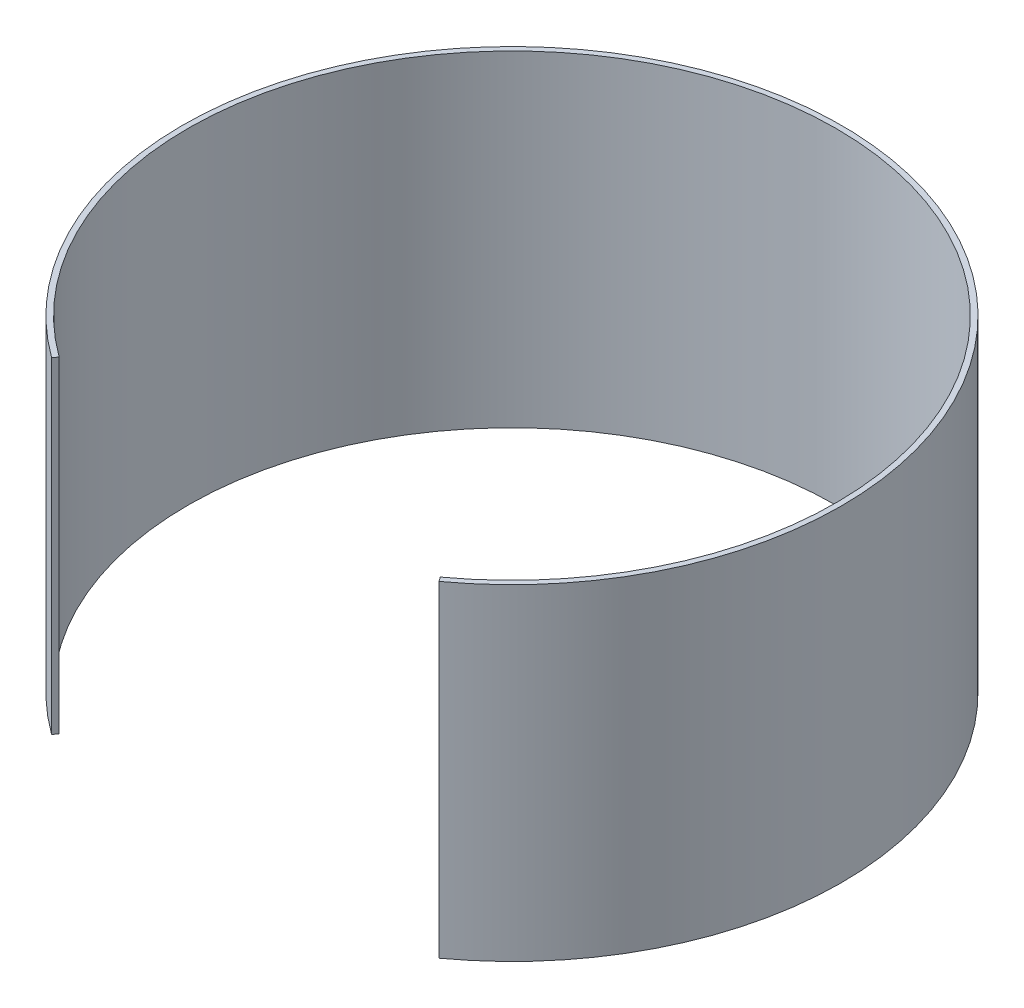
ISO-10303-21;
HEADER;
FILE_DESCRIPTION(('STEP AP214'),'2;1');
FILE_NAME('part.step','',(''),(''),'','','');
FILE_SCHEMA(('AUTOMOTIVE_DESIGN { 1 0 10303 214 1 1 1 1 }'));
ENDSEC;
DATA;
#1=APPLICATION_CONTEXT('core data for automotive mechanical design processes');
#2=APPLICATION_PROTOCOL_DEFINITION('international standard','automotive_design',2000,#1);
#3=PRODUCT_CONTEXT('',#1,'mechanical');
#4=PRODUCT('Part','Part','',(#3));
#5=PRODUCT_RELATED_PRODUCT_CATEGORY('part','',(#4));
#6=PRODUCT_DEFINITION_FORMATION('','',#4);
#7=PRODUCT_DEFINITION_CONTEXT('part definition',#1,'design');
#8=PRODUCT_DEFINITION('design','',#6,#7);
#9=PRODUCT_DEFINITION_SHAPE('','',#8);
#10=(LENGTH_UNIT() NAMED_UNIT(*) SI_UNIT(.MILLI.,.METRE.));
#11=(NAMED_UNIT(*) PLANE_ANGLE_UNIT() SI_UNIT($,.RADIAN.));
#12=(NAMED_UNIT(*) SI_UNIT($,.STERADIAN.) SOLID_ANGLE_UNIT());
#13=UNCERTAINTY_MEASURE_WITH_UNIT(LENGTH_MEASURE(1.E-05),#10,'distance_accuracy_value','');
#14=(GEOMETRIC_REPRESENTATION_CONTEXT(3) GLOBAL_UNCERTAINTY_ASSIGNED_CONTEXT((#13)) GLOBAL_UNIT_ASSIGNED_CONTEXT((#10,
#11,#12)) REPRESENTATION_CONTEXT('',''));
#15=CARTESIAN_POINT('',(0.,0.,0.));
#16=DIRECTION('',(0.,0.,1.));
#17=DIRECTION('',(1.,0.,0.));
#18=AXIS2_PLACEMENT_3D('',#15,#16,#17);
#19=CARTESIAN_POINT('',(0.,302.,0.));
#20=DIRECTION('',(0.,-1.,0.));
#21=DIRECTION('',(0.,0.,-1.));
#22=AXIS2_PLACEMENT_3D('',#19,#20,#21);
#23=CYLINDRICAL_SURFACE('',#22,305.);
#24=CARTESIAN_POINT('',(0.,0.,0.));
#25=DIRECTION('',(0.,1.,0.));
#26=DIRECTION('',(0.,0.,1.));
#27=AXIS2_PLACEMENT_3D('',#24,#25,#26);
#28=CIRCLE('',#27,305.);
#29=CARTESIAN_POINT('',(179.274501949204,0.,246.750183284359));
#30=VERTEX_POINT('',#29);
#31=CARTESIAN_POINT('',(-179.274501949204,0.,246.750183284359));
#32=VERTEX_POINT('',#31);
#33=EDGE_CURVE('E107',#30,#32,#28,.T.);
#34=ORIENTED_EDGE('',*,*,#33,.T.);
#35=DIRECTION('',(0.,-1.,0.));
#36=VECTOR('',#35,1.);
#37=CARTESIAN_POINT('',(-179.274501949204,302.,246.750183284359));
#38=LINE('',#37,#36);
#39=CARTESIAN_POINT('',(-179.274501949204,302.,246.750183284359));
#40=VERTEX_POINT('',#39);
#41=EDGE_CURVE('E11',#40,#32,#38,.T.);
#42=ORIENTED_EDGE('',*,*,#41,.F.);
#43=CARTESIAN_POINT('',(0.,302.,0.));
#44=DIRECTION('',(0.,1.,0.));
#45=DIRECTION('',(0.,0.,1.));
#46=AXIS2_PLACEMENT_3D('',#43,#44,#45);
#47=CIRCLE('',#46,305.);
#48=CARTESIAN_POINT('',(179.274501949204,302.,246.750183284359));
#49=VERTEX_POINT('',#48);
#50=EDGE_CURVE('E91',#49,#40,#47,.T.);
#51=ORIENTED_EDGE('',*,*,#50,.F.);
#52=DIRECTION('',(0.,-1.,0.));
#53=VECTOR('',#52,1.);
#54=CARTESIAN_POINT('',(179.274501949204,302.,246.750183284359));
#55=LINE('',#54,#53);
#56=EDGE_CURVE('E103',#49,#30,#55,.T.);
#57=ORIENTED_EDGE('',*,*,#56,.T.);
#58=EDGE_LOOP('',(#34,#42,#51,#57));
#59=FACE_BOUND('',#58,.T.);
#60=ADVANCED_FACE('F39',(#59),#23,.T.);
#61=CARTESIAN_POINT('',(-176.335575687742,302.,242.705098312484));
#62=DIRECTION('',(-0.809016994374947,0.,-0.587785252292474));
#63=DIRECTION('',(-0.587785252292474,0.,0.809016994374947));
#64=AXIS2_PLACEMENT_3D('',#61,#62,#63);
#65=PLANE('',#64);
#66=DIRECTION('',(0.587785252292474,0.,-0.809016994374947));
#67=VECTOR('',#66,1.);
#68=CARTESIAN_POINT('',(-176.335575687742,0.,242.705098312484));
#69=LINE('',#68,#67);
#70=CARTESIAN_POINT('',(-176.335575687742,0.,242.705098312484));
#71=VERTEX_POINT('',#70);
#72=EDGE_CURVE('E96',#32,#71,#69,.T.);
#73=ORIENTED_EDGE('',*,*,#72,.T.);
#74=DIRECTION('',(0.,-1.,0.));
#75=VECTOR('',#74,1.);
#76=CARTESIAN_POINT('',(-176.335575687742,302.,242.705098312484));
#77=LINE('',#76,#75);
#78=CARTESIAN_POINT('',(-176.335575687742,302.,242.705098312484));
#79=VERTEX_POINT('',#78);
#80=EDGE_CURVE('E48',#79,#71,#77,.T.);
#81=ORIENTED_EDGE('',*,*,#80,.F.);
#82=DIRECTION('',(0.587785252292474,0.,-0.809016994374947));
#83=VECTOR('',#82,1.);
#84=CARTESIAN_POINT('',(-176.335575687742,302.,242.705098312484));
#85=LINE('',#84,#83);
#86=EDGE_CURVE('E86',#40,#79,#85,.T.);
#87=ORIENTED_EDGE('',*,*,#86,.F.);
#88=ORIENTED_EDGE('',*,*,#41,.T.);
#89=EDGE_LOOP('',(#73,#81,#87,#88));
#90=FACE_BOUND('',#89,.T.);
#91=ADVANCED_FACE('F95',(#90),#65,.F.);
#92=CARTESIAN_POINT('',(0.,302.,0.));
#93=DIRECTION('',(0.,-1.,0.));
#94=DIRECTION('',(0.,0.,-1.));
#95=AXIS2_PLACEMENT_3D('',#92,#93,#94);
#96=CYLINDRICAL_SURFACE('',#95,300.);
#97=CARTESIAN_POINT('',(0.,0.,0.));
#98=DIRECTION('',(0.,-1.,0.));
#99=DIRECTION('',(0.,0.,1.));
#100=AXIS2_PLACEMENT_3D('',#97,#98,#99);
#101=CIRCLE('',#100,300.);
#102=CARTESIAN_POINT('',(176.335575687742,0.,242.705098312484));
#103=VERTEX_POINT('',#102);
#104=EDGE_CURVE('E73',#71,#103,#101,.T.);
#105=ORIENTED_EDGE('',*,*,#104,.T.);
#106=DIRECTION('',(0.,-1.,0.));
#107=VECTOR('',#106,1.);
#108=CARTESIAN_POINT('',(176.335575687742,302.,242.705098312484));
#109=LINE('',#108,#107);
#110=CARTESIAN_POINT('',(176.335575687742,302.,242.705098312484));
#111=VERTEX_POINT('',#110);
#112=EDGE_CURVE('E98',#111,#103,#109,.T.);
#113=ORIENTED_EDGE('',*,*,#112,.F.);
#114=CARTESIAN_POINT('',(0.,302.,0.));
#115=DIRECTION('',(0.,-1.,0.));
#116=DIRECTION('',(0.,0.,1.));
#117=AXIS2_PLACEMENT_3D('',#114,#115,#116);
#118=CIRCLE('',#117,300.);
#119=EDGE_CURVE('E89',#79,#111,#118,.T.);
#120=ORIENTED_EDGE('',*,*,#119,.F.);
#121=ORIENTED_EDGE('',*,*,#80,.T.);
#122=EDGE_LOOP('',(#105,#113,#120,#121));
#123=FACE_BOUND('',#122,.T.);
#124=ADVANCED_FACE('F99',(#123),#96,.F.);
#125=CARTESIAN_POINT('',(176.335575687742,302.,242.705098312484));
#126=DIRECTION('',(0.809016994374949,0.,-0.587785252292471));
#127=DIRECTION('',(-0.587785252292471,0.,-0.809016994374949));
#128=AXIS2_PLACEMENT_3D('',#125,#126,#127);
#129=PLANE('',#128);
#130=DIRECTION('',(0.587785252292471,0.,0.809016994374949));
#131=VECTOR('',#130,1.);
#132=CARTESIAN_POINT('',(176.335575687742,0.,242.705098312484));
#133=LINE('',#132,#131);
#134=EDGE_CURVE('E79',#103,#30,#133,.T.);
#135=ORIENTED_EDGE('',*,*,#134,.T.);
#136=ORIENTED_EDGE('',*,*,#56,.F.);
#137=DIRECTION('',(0.587785252292471,0.,0.809016994374949));
#138=VECTOR('',#137,1.);
#139=CARTESIAN_POINT('',(176.335575687742,302.,242.705098312484));
#140=LINE('',#139,#138);
#141=EDGE_CURVE('E56',#111,#49,#140,.T.);
#142=ORIENTED_EDGE('',*,*,#141,.F.);
#143=ORIENTED_EDGE('',*,*,#112,.T.);
#144=EDGE_LOOP('',(#135,#136,#142,#143));
#145=FACE_BOUND('',#144,.T.);
#146=ADVANCED_FACE('F120',(#145),#129,.F.);
#147=CARTESIAN_POINT('',(0.,302.,0.));
#148=DIRECTION('',(0.,1.,0.));
#149=DIRECTION('',(0.,0.,1.));
#150=AXIS2_PLACEMENT_3D('',#147,#148,#149);
#151=PLANE('',#150);
#152=ORIENTED_EDGE('',*,*,#50,.T.);
#153=ORIENTED_EDGE('',*,*,#86,.T.);
#154=ORIENTED_EDGE('',*,*,#119,.T.);
#155=ORIENTED_EDGE('',*,*,#141,.T.);
#156=EDGE_LOOP('',(#152,#153,#154,#155));
#157=FACE_BOUND('',#156,.T.);
#158=ADVANCED_FACE('F87',(#157),#151,.T.);
#159=CARTESIAN_POINT('',(0.,0.,0.));
#160=DIRECTION('',(0.,1.,0.));
#161=DIRECTION('',(0.,0.,1.));
#162=AXIS2_PLACEMENT_3D('',#159,#160,#161);
#163=PLANE('',#162);
#164=ORIENTED_EDGE('',*,*,#33,.F.);
#165=ORIENTED_EDGE('',*,*,#134,.F.);
#166=ORIENTED_EDGE('',*,*,#104,.F.);
#167=ORIENTED_EDGE('',*,*,#72,.F.);
#168=EDGE_LOOP('',(#164,#165,#166,#167));
#169=FACE_BOUND('',#168,.T.);
#170=ADVANCED_FACE('F123',(#169),#163,.F.);
#171=CLOSED_SHELL('',(#60,#91,#124,#146,#158,#170));
#172=MANIFOLD_SOLID_BREP('B2',#171);
#173=ADVANCED_BREP_SHAPE_REPRESENTATION('',(#18,#172),#14);
#174=SHAPE_DEFINITION_REPRESENTATION(#9,#173);
ENDSEC;
END-ISO-10303-21;
